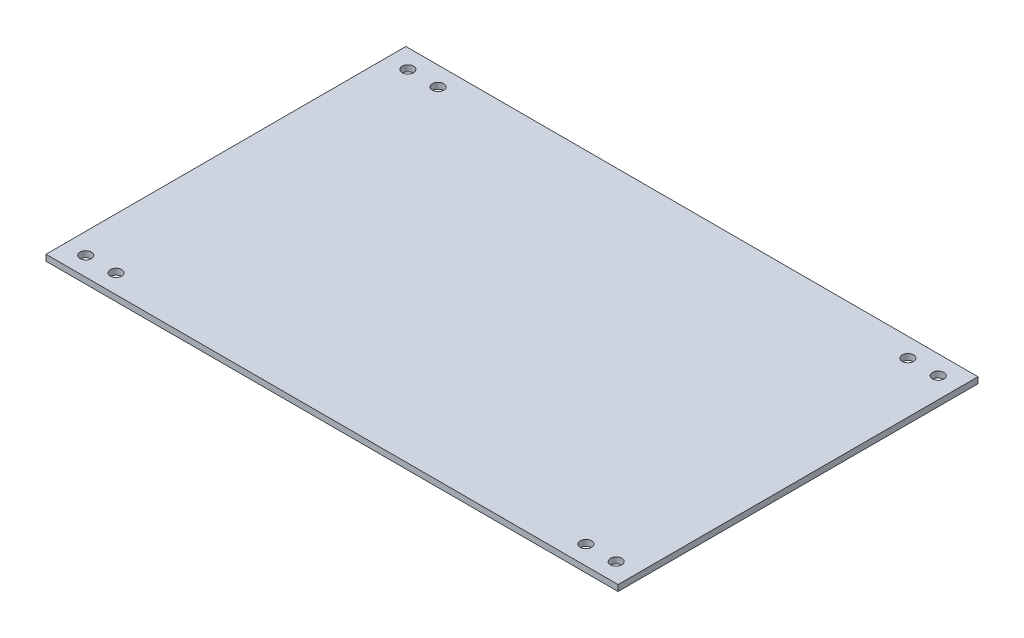
ISO-10303-21;
HEADER;
FILE_DESCRIPTION(('STEP AP214'),'2;1');
FILE_NAME('part.step','',(''),(''),'','','');
FILE_SCHEMA(('AUTOMOTIVE_DESIGN { 1 0 10303 214 1 1 1 1 }'));
ENDSEC;
DATA;
#1=APPLICATION_CONTEXT('core data for automotive mechanical design processes');
#2=APPLICATION_PROTOCOL_DEFINITION('international standard','automotive_design',2000,#1);
#3=PRODUCT_CONTEXT('',#1,'mechanical');
#4=PRODUCT('Part','Part','',(#3));
#5=PRODUCT_RELATED_PRODUCT_CATEGORY('part','',(#4));
#6=PRODUCT_DEFINITION_FORMATION('','',#4);
#7=PRODUCT_DEFINITION_CONTEXT('part definition',#1,'design');
#8=PRODUCT_DEFINITION('design','',#6,#7);
#9=PRODUCT_DEFINITION_SHAPE('','',#8);
#10=(LENGTH_UNIT() NAMED_UNIT(*) SI_UNIT(.MILLI.,.METRE.));
#11=(NAMED_UNIT(*) PLANE_ANGLE_UNIT() SI_UNIT($,.RADIAN.));
#12=(NAMED_UNIT(*) SI_UNIT($,.STERADIAN.) SOLID_ANGLE_UNIT());
#13=UNCERTAINTY_MEASURE_WITH_UNIT(LENGTH_MEASURE(1.E-05),#10,'distance_accuracy_value','');
#14=(GEOMETRIC_REPRESENTATION_CONTEXT(3) GLOBAL_UNCERTAINTY_ASSIGNED_CONTEXT((#13)) GLOBAL_UNIT_ASSIGNED_CONTEXT((#10,
#11,#12)) REPRESENTATION_CONTEXT('',''));
#15=CARTESIAN_POINT('',(0.,0.,0.));
#16=DIRECTION('',(0.,0.,1.));
#17=DIRECTION('',(1.,0.,0.));
#18=AXIS2_PLACEMENT_3D('',#15,#16,#17);
#19=CARTESIAN_POINT('',(0.,1.6,0.));
#20=DIRECTION('',(1.,0.,0.));
#21=DIRECTION('',(0.,0.,-1.));
#22=AXIS2_PLACEMENT_3D('',#19,#20,#21);
#23=PLANE('',#22);
#24=DIRECTION('',(0.,0.,1.));
#25=VECTOR('',#24,1.);
#26=CARTESIAN_POINT('',(0.,0.,0.));
#27=LINE('',#26,#25);
#28=CARTESIAN_POINT('',(0.,0.,-95.));
#29=VERTEX_POINT('',#28);
#30=CARTESIAN_POINT('',(0.,0.,0.));
#31=VERTEX_POINT('',#30);
#32=EDGE_CURVE('E101',#29,#31,#27,.T.);
#33=ORIENTED_EDGE('',*,*,#32,.T.);
#34=DIRECTION('',(0.,-1.,0.));
#35=VECTOR('',#34,1.);
#36=CARTESIAN_POINT('',(0.,1.6,0.));
#37=LINE('',#36,#35);
#38=CARTESIAN_POINT('',(0.,1.6,0.));
#39=VERTEX_POINT('',#38);
#40=EDGE_CURVE('E11',#39,#31,#37,.T.);
#41=ORIENTED_EDGE('',*,*,#40,.F.);
#42=DIRECTION('',(0.,0.,1.));
#43=VECTOR('',#42,1.);
#44=CARTESIAN_POINT('',(0.,1.6,0.));
#45=LINE('',#44,#43);
#46=CARTESIAN_POINT('',(0.,1.6,-95.));
#47=VERTEX_POINT('',#46);
#48=EDGE_CURVE('E89',#47,#39,#45,.T.);
#49=ORIENTED_EDGE('',*,*,#48,.F.);
#50=DIRECTION('',(0.,-1.,0.));
#51=VECTOR('',#50,1.);
#52=CARTESIAN_POINT('',(0.,1.6,-95.));
#53=LINE('',#52,#51);
#54=EDGE_CURVE('E97',#47,#29,#53,.T.);
#55=ORIENTED_EDGE('',*,*,#54,.T.);
#56=EDGE_LOOP('',(#33,#41,#49,#55));
#57=FACE_BOUND('',#56,.T.);
#58=ADVANCED_FACE('F38',(#57),#23,.F.);
#59=CARTESIAN_POINT('',(0.,1.6,0.));
#60=DIRECTION('',(0.,0.,-1.));
#61=DIRECTION('',(-1.,0.,0.));
#62=AXIS2_PLACEMENT_3D('',#59,#60,#61);
#63=PLANE('',#62);
#64=DIRECTION('',(1.,0.,0.));
#65=VECTOR('',#64,1.);
#66=CARTESIAN_POINT('',(0.,0.,0.));
#67=LINE('',#66,#65);
#68=CARTESIAN_POINT('',(151.,0.,0.));
#69=VERTEX_POINT('',#68);
#70=EDGE_CURVE('E93',#31,#69,#67,.T.);
#71=ORIENTED_EDGE('',*,*,#70,.T.);
#72=DIRECTION('',(0.,-1.,0.));
#73=VECTOR('',#72,1.);
#74=CARTESIAN_POINT('',(151.,1.6,0.));
#75=LINE('',#74,#73);
#76=CARTESIAN_POINT('',(151.,1.6,0.));
#77=VERTEX_POINT('',#76);
#78=EDGE_CURVE('E46',#77,#69,#75,.T.);
#79=ORIENTED_EDGE('',*,*,#78,.F.);
#80=DIRECTION('',(1.,0.,0.));
#81=VECTOR('',#80,1.);
#82=CARTESIAN_POINT('',(0.,1.6,0.));
#83=LINE('',#82,#81);
#84=EDGE_CURVE('E84',#39,#77,#83,.T.);
#85=ORIENTED_EDGE('',*,*,#84,.F.);
#86=ORIENTED_EDGE('',*,*,#40,.T.);
#87=EDGE_LOOP('',(#71,#79,#85,#86));
#88=FACE_BOUND('',#87,.T.);
#89=ADVANCED_FACE('F92',(#88),#63,.F.);
#90=CARTESIAN_POINT('',(151.,1.6,0.));
#91=DIRECTION('',(-1.,0.,0.));
#92=DIRECTION('',(0.,0.,1.));
#93=AXIS2_PLACEMENT_3D('',#90,#91,#92);
#94=PLANE('',#93);
#95=DIRECTION('',(0.,0.,-1.));
#96=VECTOR('',#95,1.);
#97=CARTESIAN_POINT('',(151.,0.,0.));
#98=LINE('',#97,#96);
#99=CARTESIAN_POINT('',(151.,0.,-95.));
#100=VERTEX_POINT('',#99);
#101=EDGE_CURVE('E71',#69,#100,#98,.T.);
#102=ORIENTED_EDGE('',*,*,#101,.T.);
#103=DIRECTION('',(0.,-1.,0.));
#104=VECTOR('',#103,1.);
#105=CARTESIAN_POINT('',(151.,1.6,-95.));
#106=LINE('',#105,#104);
#107=CARTESIAN_POINT('',(151.,1.6,-95.));
#108=VERTEX_POINT('',#107);
#109=EDGE_CURVE('E94',#108,#100,#106,.T.);
#110=ORIENTED_EDGE('',*,*,#109,.F.);
#111=DIRECTION('',(0.,0.,-1.));
#112=VECTOR('',#111,1.);
#113=CARTESIAN_POINT('',(151.,1.6,0.));
#114=LINE('',#113,#112);
#115=EDGE_CURVE('E87',#77,#108,#114,.T.);
#116=ORIENTED_EDGE('',*,*,#115,.F.);
#117=ORIENTED_EDGE('',*,*,#78,.T.);
#118=EDGE_LOOP('',(#102,#110,#116,#117));
#119=FACE_BOUND('',#118,.T.);
#120=ADVANCED_FACE('F95',(#119),#94,.F.);
#121=CARTESIAN_POINT('',(0.,1.6,-95.));
#122=DIRECTION('',(0.,0.,1.));
#123=DIRECTION('',(1.,0.,0.));
#124=AXIS2_PLACEMENT_3D('',#121,#122,#123);
#125=PLANE('',#124);
#126=DIRECTION('',(-1.,0.,0.));
#127=VECTOR('',#126,1.);
#128=CARTESIAN_POINT('',(0.,0.,-95.));
#129=LINE('',#128,#127);
#130=EDGE_CURVE('E77',#100,#29,#129,.T.);
#131=ORIENTED_EDGE('',*,*,#130,.T.);
#132=ORIENTED_EDGE('',*,*,#54,.F.);
#133=DIRECTION('',(-1.,0.,0.));
#134=VECTOR('',#133,1.);
#135=CARTESIAN_POINT('',(0.,1.6,-95.));
#136=LINE('',#135,#134);
#137=EDGE_CURVE('E54',#108,#47,#136,.T.);
#138=ORIENTED_EDGE('',*,*,#137,.F.);
#139=ORIENTED_EDGE('',*,*,#109,.T.);
#140=EDGE_LOOP('',(#131,#132,#138,#139));
#141=FACE_BOUND('',#140,.T.);
#142=ADVANCED_FACE('F109',(#141),#125,.F.);
#143=CARTESIAN_POINT('',(0.,1.6,0.));
#144=DIRECTION('',(0.,-1.,0.));
#145=DIRECTION('',(0.,0.,-1.));
#146=AXIS2_PLACEMENT_3D('',#143,#144,#145);
#147=PLANE('',#146);
#148=CARTESIAN_POINT('',(145.5,1.6,-90.));
#149=DIRECTION('',(0.,1.,0.));
#150=DIRECTION('',(0.,0.,-1.));
#151=AXIS2_PLACEMENT_3D('',#148,#149,#150);
#152=CIRCLE('',#151,1.5);
#153=CARTESIAN_POINT('',(145.5,1.6,-91.5));
#154=VERTEX_POINT('',#153);
#155=EDGE_CURVE('E140',#154,#154,#152,.T.);
#156=ORIENTED_EDGE('',*,*,#155,.F.);
#157=EDGE_LOOP('',(#156));
#158=FACE_BOUND('',#157,.T.);
#159=CARTESIAN_POINT('',(145.5,1.6,-5.00000000000001));
#160=DIRECTION('',(0.,1.,0.));
#161=DIRECTION('',(0.,0.,1.));
#162=AXIS2_PLACEMENT_3D('',#159,#160,#161);
#163=CIRCLE('',#162,1.5);
#164=CARTESIAN_POINT('',(145.5,1.6,-3.50000000000002));
#165=VERTEX_POINT('',#164);
#166=EDGE_CURVE('E134',#165,#165,#163,.T.);
#167=ORIENTED_EDGE('',*,*,#166,.F.);
#168=EDGE_LOOP('',(#167));
#169=FACE_BOUND('',#168,.T.);
#170=CARTESIAN_POINT('',(5.5,1.6,-5.));
#171=DIRECTION('',(0.,1.,0.));
#172=DIRECTION('',(0.,0.,-1.));
#173=AXIS2_PLACEMENT_3D('',#170,#171,#172);
#174=CIRCLE('',#173,1.5);
#175=CARTESIAN_POINT('',(5.5,1.6,-6.5));
#176=VERTEX_POINT('',#175);
#177=EDGE_CURVE('E128',#176,#176,#174,.T.);
#178=ORIENTED_EDGE('',*,*,#177,.F.);
#179=EDGE_LOOP('',(#178));
#180=FACE_BOUND('',#179,.T.);
#181=CARTESIAN_POINT('',(13.5,1.6,-90.));
#182=DIRECTION('',(0.,1.,0.));
#183=DIRECTION('',(0.,0.,1.));
#184=AXIS2_PLACEMENT_3D('',#181,#182,#183);
#185=CIRCLE('',#184,1.5);
#186=CARTESIAN_POINT('',(13.5,1.6,-88.5));
#187=VERTEX_POINT('',#186);
#188=EDGE_CURVE('E121',#187,#187,#185,.T.);
#189=ORIENTED_EDGE('',*,*,#188,.F.);
#190=EDGE_LOOP('',(#189));
#191=FACE_BOUND('',#190,.T.);
#192=CARTESIAN_POINT('',(13.5,1.6,-5.));
#193=DIRECTION('',(0.,1.,0.));
#194=DIRECTION('',(0.,0.,-1.));
#195=AXIS2_PLACEMENT_3D('',#192,#193,#194);
#196=CIRCLE('',#195,1.5);
#197=CARTESIAN_POINT('',(13.5,1.6,-6.50000000000001));
#198=VERTEX_POINT('',#197);
#199=EDGE_CURVE('E157',#198,#198,#196,.T.);
#200=ORIENTED_EDGE('',*,*,#199,.F.);
#201=EDGE_LOOP('',(#200));
#202=FACE_BOUND('',#201,.T.);
#203=CARTESIAN_POINT('',(137.5,1.6,-5.00000000000002));
#204=DIRECTION('',(0.,1.,0.));
#205=DIRECTION('',(0.,0.,1.));
#206=AXIS2_PLACEMENT_3D('',#203,#204,#205);
#207=CIRCLE('',#206,1.5);
#208=CARTESIAN_POINT('',(137.5,1.6,-3.50000000000002));
#209=VERTEX_POINT('',#208);
#210=EDGE_CURVE('E151',#209,#209,#207,.T.);
#211=ORIENTED_EDGE('',*,*,#210,.F.);
#212=EDGE_LOOP('',(#211));
#213=FACE_BOUND('',#212,.T.);
#214=CARTESIAN_POINT('',(137.5,1.6,-90.));
#215=DIRECTION('',(0.,1.,0.));
#216=DIRECTION('',(0.,0.,-1.));
#217=AXIS2_PLACEMENT_3D('',#214,#215,#216);
#218=CIRCLE('',#217,1.5);
#219=CARTESIAN_POINT('',(137.5,1.6,-91.5));
#220=VERTEX_POINT('',#219);
#221=EDGE_CURVE('E145',#220,#220,#218,.T.);
#222=ORIENTED_EDGE('',*,*,#221,.F.);
#223=EDGE_LOOP('',(#222));
#224=FACE_BOUND('',#223,.T.);
#225=CARTESIAN_POINT('',(5.49999999999999,1.6,-90.));
#226=DIRECTION('',(0.,1.,0.));
#227=DIRECTION('',(0.,0.,1.));
#228=AXIS2_PLACEMENT_3D('',#225,#226,#227);
#229=CIRCLE('',#228,1.5);
#230=CARTESIAN_POINT('',(5.49999999999999,1.6,-88.5));
#231=VERTEX_POINT('',#230);
#232=EDGE_CURVE('E115',#231,#231,#229,.T.);
#233=ORIENTED_EDGE('',*,*,#232,.F.);
#234=EDGE_LOOP('',(#233));
#235=FACE_BOUND('',#234,.T.);
#236=ORIENTED_EDGE('',*,*,#48,.T.);
#237=ORIENTED_EDGE('',*,*,#84,.T.);
#238=ORIENTED_EDGE('',*,*,#115,.T.);
#239=ORIENTED_EDGE('',*,*,#137,.T.);
#240=EDGE_LOOP('',(#236,#237,#238,#239));
#241=FACE_BOUND('',#240,.T.);
#242=ADVANCED_FACE('F85',(#158,#169,#180,#191,#202,#213,#224,#235,#241),#147,.F.);
#243=CARTESIAN_POINT('',(0.,0.,0.));
#244=DIRECTION('',(0.,-1.,0.));
#245=DIRECTION('',(0.,0.,-1.));
#246=AXIS2_PLACEMENT_3D('',#243,#244,#245);
#247=PLANE('',#246);
#248=CARTESIAN_POINT('',(145.5,0.,-90.));
#249=DIRECTION('',(0.,1.,0.));
#250=DIRECTION('',(0.,0.,-1.));
#251=AXIS2_PLACEMENT_3D('',#248,#249,#250);
#252=CIRCLE('',#251,1.5);
#253=CARTESIAN_POINT('',(145.5,0.,-91.5));
#254=VERTEX_POINT('',#253);
#255=EDGE_CURVE('E118',#254,#254,#252,.T.);
#256=ORIENTED_EDGE('',*,*,#255,.T.);
#257=EDGE_LOOP('',(#256));
#258=FACE_BOUND('',#257,.T.);
#259=CARTESIAN_POINT('',(145.5,0.,-5.00000000000001));
#260=DIRECTION('',(0.,1.,0.));
#261=DIRECTION('',(0.,0.,1.));
#262=AXIS2_PLACEMENT_3D('',#259,#260,#261);
#263=CIRCLE('',#262,1.5);
#264=CARTESIAN_POINT('',(145.5,0.,-3.50000000000002));
#265=VERTEX_POINT('',#264);
#266=EDGE_CURVE('E137',#265,#265,#263,.T.);
#267=ORIENTED_EDGE('',*,*,#266,.T.);
#268=EDGE_LOOP('',(#267));
#269=FACE_BOUND('',#268,.T.);
#270=CARTESIAN_POINT('',(5.5,0.,-5.));
#271=DIRECTION('',(0.,1.,0.));
#272=DIRECTION('',(0.,0.,-1.));
#273=AXIS2_PLACEMENT_3D('',#270,#271,#272);
#274=CIRCLE('',#273,1.5);
#275=CARTESIAN_POINT('',(5.5,0.,-6.5));
#276=VERTEX_POINT('',#275);
#277=EDGE_CURVE('E131',#276,#276,#274,.T.);
#278=ORIENTED_EDGE('',*,*,#277,.T.);
#279=EDGE_LOOP('',(#278));
#280=FACE_BOUND('',#279,.T.);
#281=CARTESIAN_POINT('',(13.5,0.,-90.));
#282=DIRECTION('',(0.,1.,0.));
#283=DIRECTION('',(0.,0.,1.));
#284=AXIS2_PLACEMENT_3D('',#281,#282,#283);
#285=CIRCLE('',#284,1.5);
#286=CARTESIAN_POINT('',(13.5,0.,-88.5));
#287=VERTEX_POINT('',#286);
#288=EDGE_CURVE('E124',#287,#287,#285,.T.);
#289=ORIENTED_EDGE('',*,*,#288,.T.);
#290=EDGE_LOOP('',(#289));
#291=FACE_BOUND('',#290,.T.);
#292=CARTESIAN_POINT('',(13.5,0.,-5.));
#293=DIRECTION('',(0.,1.,0.));
#294=DIRECTION('',(0.,0.,-1.));
#295=AXIS2_PLACEMENT_3D('',#292,#293,#294);
#296=CIRCLE('',#295,1.5);
#297=CARTESIAN_POINT('',(13.5,0.,-6.50000000000001));
#298=VERTEX_POINT('',#297);
#299=EDGE_CURVE('E125',#298,#298,#296,.T.);
#300=ORIENTED_EDGE('',*,*,#299,.T.);
#301=EDGE_LOOP('',(#300));
#302=FACE_BOUND('',#301,.T.);
#303=CARTESIAN_POINT('',(137.5,0.,-5.00000000000002));
#304=DIRECTION('',(0.,1.,0.));
#305=DIRECTION('',(0.,0.,1.));
#306=AXIS2_PLACEMENT_3D('',#303,#304,#305);
#307=CIRCLE('',#306,1.5);
#308=CARTESIAN_POINT('',(137.5,0.,-3.50000000000002));
#309=VERTEX_POINT('',#308);
#310=EDGE_CURVE('E154',#309,#309,#307,.T.);
#311=ORIENTED_EDGE('',*,*,#310,.T.);
#312=EDGE_LOOP('',(#311));
#313=FACE_BOUND('',#312,.T.);
#314=CARTESIAN_POINT('',(137.5,0.,-90.));
#315=DIRECTION('',(0.,1.,0.));
#316=DIRECTION('',(0.,0.,-1.));
#317=AXIS2_PLACEMENT_3D('',#314,#315,#316);
#318=CIRCLE('',#317,1.5);
#319=CARTESIAN_POINT('',(137.5,0.,-91.5));
#320=VERTEX_POINT('',#319);
#321=EDGE_CURVE('E148',#320,#320,#318,.T.);
#322=ORIENTED_EDGE('',*,*,#321,.T.);
#323=EDGE_LOOP('',(#322));
#324=FACE_BOUND('',#323,.T.);
#325=CARTESIAN_POINT('',(5.49999999999999,0.,-90.));
#326=DIRECTION('',(0.,1.,0.));
#327=DIRECTION('',(0.,0.,1.));
#328=AXIS2_PLACEMENT_3D('',#325,#326,#327);
#329=CIRCLE('',#328,1.5);
#330=CARTESIAN_POINT('',(5.49999999999999,0.,-88.5));
#331=VERTEX_POINT('',#330);
#332=EDGE_CURVE('E104',#331,#331,#329,.T.);
#333=ORIENTED_EDGE('',*,*,#332,.T.);
#334=EDGE_LOOP('',(#333));
#335=FACE_BOUND('',#334,.T.);
#336=ORIENTED_EDGE('',*,*,#32,.F.);
#337=ORIENTED_EDGE('',*,*,#130,.F.);
#338=ORIENTED_EDGE('',*,*,#101,.F.);
#339=ORIENTED_EDGE('',*,*,#70,.F.);
#340=EDGE_LOOP('',(#336,#337,#338,#339));
#341=FACE_BOUND('',#340,.T.);
#342=ADVANCED_FACE('F112',(#258,#269,#280,#291,#302,#313,#324,#335,#341),#247,.T.);
#343=CARTESIAN_POINT('',(5.49999999999999,0.,-90.));
#344=DIRECTION('',(0.,1.,0.));
#345=DIRECTION('',(0.,0.,1.));
#346=AXIS2_PLACEMENT_3D('',#343,#344,#345);
#347=CYLINDRICAL_SURFACE('',#346,1.5);
#348=ORIENTED_EDGE('',*,*,#332,.F.);
#349=EDGE_LOOP('',(#348));
#350=FACE_BOUND('',#349,.T.);
#351=ORIENTED_EDGE('',*,*,#232,.T.);
#352=EDGE_LOOP('',(#351));
#353=FACE_BOUND('',#352,.T.);
#354=ADVANCED_FACE('F183',(#350,#353),#347,.F.);
#355=CARTESIAN_POINT('',(137.5,0.,-90.));
#356=DIRECTION('',(0.,1.,0.));
#357=DIRECTION('',(0.,0.,1.));
#358=AXIS2_PLACEMENT_3D('',#355,#356,#357);
#359=CYLINDRICAL_SURFACE('',#358,1.5);
#360=ORIENTED_EDGE('',*,*,#321,.F.);
#361=EDGE_LOOP('',(#360));
#362=FACE_BOUND('',#361,.T.);
#363=ORIENTED_EDGE('',*,*,#221,.T.);
#364=EDGE_LOOP('',(#363));
#365=FACE_BOUND('',#364,.T.);
#366=ADVANCED_FACE('F185',(#362,#365),#359,.F.);
#367=CARTESIAN_POINT('',(137.5,0.,-5.00000000000002));
#368=DIRECTION('',(0.,1.,0.));
#369=DIRECTION('',(0.,0.,1.));
#370=AXIS2_PLACEMENT_3D('',#367,#368,#369);
#371=CYLINDRICAL_SURFACE('',#370,1.5);
#372=ORIENTED_EDGE('',*,*,#310,.F.);
#373=EDGE_LOOP('',(#372));
#374=FACE_BOUND('',#373,.T.);
#375=ORIENTED_EDGE('',*,*,#210,.T.);
#376=EDGE_LOOP('',(#375));
#377=FACE_BOUND('',#376,.T.);
#378=ADVANCED_FACE('F169',(#374,#377),#371,.F.);
#379=CARTESIAN_POINT('',(13.5,0.,-5.));
#380=DIRECTION('',(0.,1.,0.));
#381=DIRECTION('',(0.,0.,1.));
#382=AXIS2_PLACEMENT_3D('',#379,#380,#381);
#383=CYLINDRICAL_SURFACE('',#382,1.5);
#384=ORIENTED_EDGE('',*,*,#299,.F.);
#385=EDGE_LOOP('',(#384));
#386=FACE_BOUND('',#385,.T.);
#387=ORIENTED_EDGE('',*,*,#199,.T.);
#388=EDGE_LOOP('',(#387));
#389=FACE_BOUND('',#388,.T.);
#390=ADVANCED_FACE('F165',(#386,#389),#383,.F.);
#391=CARTESIAN_POINT('',(13.5,0.,-90.));
#392=DIRECTION('',(0.,1.,0.));
#393=DIRECTION('',(0.,0.,1.));
#394=AXIS2_PLACEMENT_3D('',#391,#392,#393);
#395=CYLINDRICAL_SURFACE('',#394,1.5);
#396=ORIENTED_EDGE('',*,*,#288,.F.);
#397=EDGE_LOOP('',(#396));
#398=FACE_BOUND('',#397,.T.);
#399=ORIENTED_EDGE('',*,*,#188,.T.);
#400=EDGE_LOOP('',(#399));
#401=FACE_BOUND('',#400,.T.);
#402=ADVANCED_FACE('F168',(#398,#401),#395,.F.);
#403=CARTESIAN_POINT('',(5.5,0.,-5.));
#404=DIRECTION('',(0.,1.,0.));
#405=DIRECTION('',(0.,0.,1.));
#406=AXIS2_PLACEMENT_3D('',#403,#404,#405);
#407=CYLINDRICAL_SURFACE('',#406,1.5);
#408=ORIENTED_EDGE('',*,*,#277,.F.);
#409=EDGE_LOOP('',(#408));
#410=FACE_BOUND('',#409,.T.);
#411=ORIENTED_EDGE('',*,*,#177,.T.);
#412=EDGE_LOOP('',(#411));
#413=FACE_BOUND('',#412,.T.);
#414=ADVANCED_FACE('F256',(#410,#413),#407,.F.);
#415=CARTESIAN_POINT('',(145.5,0.,-5.00000000000001));
#416=DIRECTION('',(0.,1.,0.));
#417=DIRECTION('',(0.,0.,1.));
#418=AXIS2_PLACEMENT_3D('',#415,#416,#417);
#419=CYLINDRICAL_SURFACE('',#418,1.5);
#420=ORIENTED_EDGE('',*,*,#266,.F.);
#421=EDGE_LOOP('',(#420));
#422=FACE_BOUND('',#421,.T.);
#423=ORIENTED_EDGE('',*,*,#166,.T.);
#424=EDGE_LOOP('',(#423));
#425=FACE_BOUND('',#424,.T.);
#426=ADVANCED_FACE('F265',(#422,#425),#419,.F.);
#427=CARTESIAN_POINT('',(145.5,0.,-90.));
#428=DIRECTION('',(0.,1.,0.));
#429=DIRECTION('',(0.,0.,1.));
#430=AXIS2_PLACEMENT_3D('',#427,#428,#429);
#431=CYLINDRICAL_SURFACE('',#430,1.5);
#432=ORIENTED_EDGE('',*,*,#255,.F.);
#433=EDGE_LOOP('',(#432));
#434=FACE_BOUND('',#433,.T.);
#435=ORIENTED_EDGE('',*,*,#155,.T.);
#436=EDGE_LOOP('',(#435));
#437=FACE_BOUND('',#436,.T.);
#438=ADVANCED_FACE('F275',(#434,#437),#431,.F.);
#439=CLOSED_SHELL('',(#58,#89,#120,#142,#242,#342,#354,#366,#378,#390,#402,#414,#426,#438));
#440=MANIFOLD_SOLID_BREP('B2',#439);
#441=ADVANCED_BREP_SHAPE_REPRESENTATION('',(#18,#440),#14);
#442=SHAPE_DEFINITION_REPRESENTATION(#9,#441);
ENDSEC;
END-ISO-10303-21;
